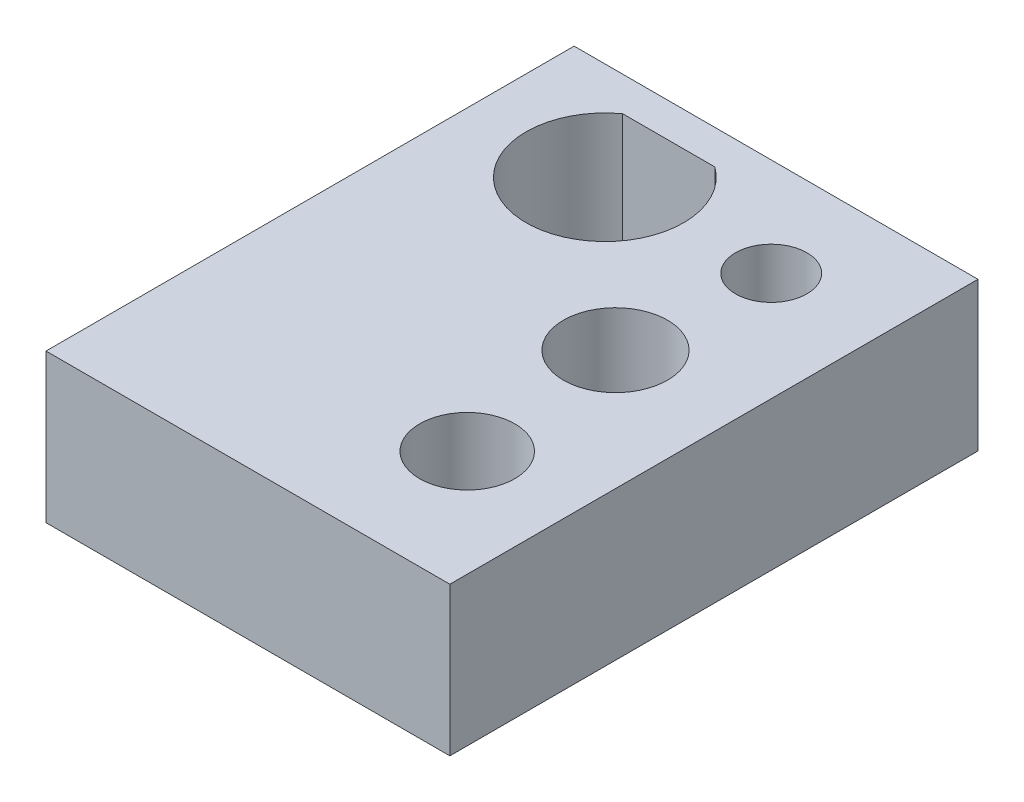
ISO-10303-21;
HEADER;
FILE_DESCRIPTION(('STEP AP214'),'2;1');
FILE_NAME('part.step','',(''),(''),'','','');
FILE_SCHEMA(('AUTOMOTIVE_DESIGN { 1 0 10303 214 1 1 1 1 }'));
ENDSEC;
DATA;
#1=APPLICATION_CONTEXT('core data for automotive mechanical design processes');
#2=APPLICATION_PROTOCOL_DEFINITION('international standard','automotive_design',2000,#1);
#3=PRODUCT_CONTEXT('',#1,'mechanical');
#4=PRODUCT('Part','Part','',(#3));
#5=PRODUCT_RELATED_PRODUCT_CATEGORY('part','',(#4));
#6=PRODUCT_DEFINITION_FORMATION('','',#4);
#7=PRODUCT_DEFINITION_CONTEXT('part definition',#1,'design');
#8=PRODUCT_DEFINITION('design','',#6,#7);
#9=PRODUCT_DEFINITION_SHAPE('','',#8);
#10=(LENGTH_UNIT() NAMED_UNIT(*) SI_UNIT(.MILLI.,.METRE.));
#11=(NAMED_UNIT(*) PLANE_ANGLE_UNIT() SI_UNIT($,.RADIAN.));
#12=(NAMED_UNIT(*) SI_UNIT($,.STERADIAN.) SOLID_ANGLE_UNIT());
#13=UNCERTAINTY_MEASURE_WITH_UNIT(LENGTH_MEASURE(1.E-05),#10,'distance_accuracy_value','');
#14=(GEOMETRIC_REPRESENTATION_CONTEXT(3) GLOBAL_UNCERTAINTY_ASSIGNED_CONTEXT((#13)) GLOBAL_UNIT_ASSIGNED_CONTEXT((#10,
#11,#12)) REPRESENTATION_CONTEXT('',''));
#15=CARTESIAN_POINT('',(0.,0.,0.));
#16=DIRECTION('',(0.,0.,1.));
#17=DIRECTION('',(1.,0.,0.));
#18=AXIS2_PLACEMENT_3D('',#15,#16,#17);
#19=CARTESIAN_POINT('',(0.,5.,0.));
#20=DIRECTION('',(0.,1.,0.));
#21=DIRECTION('',(0.,0.,1.));
#22=AXIS2_PLACEMENT_3D('',#19,#20,#21);
#23=PLANE('',#22);
#24=CARTESIAN_POINT('',(-2.66704706228756,5.,-1.23778604688469));
#25=DIRECTION('',(0.,1.,0.));
#26=DIRECTION('',(0.,0.,1.));
#27=AXIS2_PLACEMENT_3D('',#24,#25,#26);
#28=CIRCLE('',#27,1.2);
#29=CARTESIAN_POINT('',(-2.66704706228756,5.,-0.0377860468846888));
#30=VERTEX_POINT('',#29);
#31=EDGE_CURVE('E211',#30,#30,#28,.T.);
#32=ORIENTED_EDGE('',*,*,#31,.F.);
#33=EDGE_LOOP('',(#32));
#34=FACE_BOUND('',#33,.T.);
#35=DIRECTION('',(-1.,0.,0.));
#36=VECTOR('',#35,1.);
#37=CARTESIAN_POINT('',(-9.81090987129564,5.,-3.38778604688469));
#38=LINE('',#37,#36);
#39=CARTESIAN_POINT('',(-6.71252319432971,5.,-3.38778604688469));
#40=VERTEX_POINT('',#39);
#41=CARTESIAN_POINT('',(-9.81090987129564,5.,-3.38778604688469));
#42=VERTEX_POINT('',#41);
#43=EDGE_CURVE('E93',#40,#42,#38,.T.);
#44=ORIENTED_EDGE('',*,*,#43,.F.);
#45=CARTESIAN_POINT('',(-8.26171653281267,5.,-1.23778604688469));
#46=DIRECTION('',(0.,1.,0.));
#47=DIRECTION('',(0.,0.,1.));
#48=AXIS2_PLACEMENT_3D('',#45,#46,#47);
#49=CIRCLE('',#48,2.65);
#50=EDGE_CURVE('E99',#42,#40,#49,.T.);
#51=ORIENTED_EDGE('',*,*,#50,.F.);
#52=EDGE_LOOP('',(#44,#51));
#53=FACE_BOUND('',#52,.T.);
#54=DIRECTION('',(0.,0.,1.));
#55=VECTOR('',#54,1.);
#56=CARTESIAN_POINT('',(-12.5977729596847,5.,-4.54054716192483));
#57=LINE('',#56,#55);
#58=CARTESIAN_POINT('',(-12.5977729596847,5.,-4.54054716192483));
#59=VERTEX_POINT('',#58);
#60=CARTESIAN_POINT('',(-12.5977729596847,5.,13.220461971685));
#61=VERTEX_POINT('',#60);
#62=EDGE_CURVE('E115',#59,#61,#57,.T.);
#63=ORIENTED_EDGE('',*,*,#62,.T.);
#64=DIRECTION('',(1.,0.,0.));
#65=VECTOR('',#64,1.);
#66=CARTESIAN_POINT('',(-12.5977729596847,5.,13.220461971685));
#67=LINE('',#66,#65);
#68=CARTESIAN_POINT('',(0.984175201311116,5.,13.220461971685));
#69=VERTEX_POINT('',#68);
#70=EDGE_CURVE('E118',#61,#69,#67,.T.);
#71=ORIENTED_EDGE('',*,*,#70,.T.);
#72=DIRECTION('',(0.,0.,-1.));
#73=VECTOR('',#72,1.);
#74=CARTESIAN_POINT('',(0.984175201311114,5.,-4.54054716192483));
#75=LINE('',#74,#73);
#76=CARTESIAN_POINT('',(0.984175201311114,5.,-4.54054716192483));
#77=VERTEX_POINT('',#76);
#78=EDGE_CURVE('E121',#69,#77,#75,.T.);
#79=ORIENTED_EDGE('',*,*,#78,.T.);
#80=DIRECTION('',(-1.,0.,0.));
#81=VECTOR('',#80,1.);
#82=CARTESIAN_POINT('',(-12.5977729596847,5.,-4.54054716192483));
#83=LINE('',#82,#81);
#84=EDGE_CURVE('E123',#77,#59,#83,.T.);
#85=ORIENTED_EDGE('',*,*,#84,.T.);
#86=EDGE_LOOP('',(#63,#71,#79,#85));
#87=FACE_BOUND('',#86,.T.);
#88=CARTESIAN_POINT('',(-2.59605636495823,5.,9.056132184409));
#89=DIRECTION('',(0.,1.,0.));
#90=DIRECTION('',(0.,0.,1.));
#91=AXIS2_PLACEMENT_3D('',#88,#89,#90);
#92=CIRCLE('',#91,1.6);
#93=CARTESIAN_POINT('',(-2.59605636495823,5.,10.656132184409));
#94=VERTEX_POINT('',#93);
#95=EDGE_CURVE('E111',#94,#94,#92,.T.);
#96=ORIENTED_EDGE('',*,*,#95,.F.);
#97=EDGE_LOOP('',(#96));
#98=FACE_BOUND('',#97,.T.);
#99=CARTESIAN_POINT('',(-3.0466930249895,5.,3.61962648657831));
#100=DIRECTION('',(0.,1.,0.));
#101=DIRECTION('',(0.,0.,1.));
#102=AXIS2_PLACEMENT_3D('',#99,#100,#101);
#103=CIRCLE('',#102,1.75);
#104=CARTESIAN_POINT('',(-3.0466930249895,5.,5.36962648657831));
#105=VERTEX_POINT('',#104);
#106=EDGE_CURVE('E202',#105,#105,#103,.T.);
#107=ORIENTED_EDGE('',*,*,#106,.F.);
#108=EDGE_LOOP('',(#107));
#109=FACE_BOUND('',#108,.T.);
#110=ADVANCED_FACE('F41',(#34,#53,#87,#98,#109),#23,.T.);
#111=CARTESIAN_POINT('',(0.,0.,0.));
#112=DIRECTION('',(0.,1.,0.));
#113=DIRECTION('',(0.,0.,1.));
#114=AXIS2_PLACEMENT_3D('',#111,#112,#113);
#115=PLANE('',#114);
#116=DIRECTION('',(0.,0.,1.));
#117=VECTOR('',#116,1.);
#118=CARTESIAN_POINT('',(-12.5977729596847,0.,-4.54054716192483));
#119=LINE('',#118,#117);
#120=CARTESIAN_POINT('',(-12.5977729596847,0.,-4.54054716192483));
#121=VERTEX_POINT('',#120);
#122=CARTESIAN_POINT('',(-12.5977729596847,0.,13.220461971685));
#123=VERTEX_POINT('',#122);
#124=EDGE_CURVE('E114',#121,#123,#119,.T.);
#125=ORIENTED_EDGE('',*,*,#124,.F.);
#126=DIRECTION('',(-1.,0.,0.));
#127=VECTOR('',#126,1.);
#128=CARTESIAN_POINT('',(-12.5977729596847,0.,-4.54054716192483));
#129=LINE('',#128,#127);
#130=CARTESIAN_POINT('',(0.984175201311114,0.,-4.54054716192483));
#131=VERTEX_POINT('',#130);
#132=EDGE_CURVE('E119',#131,#121,#129,.T.);
#133=ORIENTED_EDGE('',*,*,#132,.F.);
#134=DIRECTION('',(0.,0.,-1.));
#135=VECTOR('',#134,1.);
#136=CARTESIAN_POINT('',(0.984175201311114,0.,-4.54054716192483));
#137=LINE('',#136,#135);
#138=CARTESIAN_POINT('',(0.984175201311116,0.,13.220461971685));
#139=VERTEX_POINT('',#138);
#140=EDGE_CURVE('E130',#139,#131,#137,.T.);
#141=ORIENTED_EDGE('',*,*,#140,.F.);
#142=DIRECTION('',(1.,0.,0.));
#143=VECTOR('',#142,1.);
#144=CARTESIAN_POINT('',(-12.5977729596847,0.,13.220461971685));
#145=LINE('',#144,#143);
#146=EDGE_CURVE('E128',#123,#139,#145,.T.);
#147=ORIENTED_EDGE('',*,*,#146,.F.);
#148=EDGE_LOOP('',(#125,#133,#141,#147));
#149=FACE_BOUND('',#148,.T.);
#150=CARTESIAN_POINT('',(-8.26171653281267,0.,-1.23778604688469));
#151=DIRECTION('',(0.,1.,0.));
#152=DIRECTION('',(0.,0.,1.));
#153=AXIS2_PLACEMENT_3D('',#150,#151,#152);
#154=CIRCLE('',#153,2.65);
#155=CARTESIAN_POINT('',(-9.81090987129564,0.,-3.38778604688469));
#156=VERTEX_POINT('',#155);
#157=CARTESIAN_POINT('',(-6.71252319432971,0.,-3.38778604688469));
#158=VERTEX_POINT('',#157);
#159=EDGE_CURVE('E63',#156,#158,#154,.T.);
#160=ORIENTED_EDGE('',*,*,#159,.T.);
#161=DIRECTION('',(-1.,0.,0.));
#162=VECTOR('',#161,1.);
#163=CARTESIAN_POINT('',(-9.81090987129564,0.,-3.38778604688469));
#164=LINE('',#163,#162);
#165=EDGE_CURVE('E104',#158,#156,#164,.T.);
#166=ORIENTED_EDGE('',*,*,#165,.T.);
#167=EDGE_LOOP('',(#160,#166));
#168=FACE_BOUND('',#167,.T.);
#169=CARTESIAN_POINT('',(-2.59605636495823,0.,9.056132184409));
#170=DIRECTION('',(0.,1.,0.));
#171=DIRECTION('',(0.,0.,1.));
#172=AXIS2_PLACEMENT_3D('',#169,#170,#171);
#173=CIRCLE('',#172,1.6);
#174=CARTESIAN_POINT('',(-2.59605636495823,0.,10.656132184409));
#175=VERTEX_POINT('',#174);
#176=EDGE_CURVE('E108',#175,#175,#173,.T.);
#177=ORIENTED_EDGE('',*,*,#176,.T.);
#178=EDGE_LOOP('',(#177));
#179=FACE_BOUND('',#178,.T.);
#180=CARTESIAN_POINT('',(-2.66704706228756,0.,-1.23778604688469));
#181=DIRECTION('',(0.,1.,0.));
#182=DIRECTION('',(0.,0.,1.));
#183=AXIS2_PLACEMENT_3D('',#180,#181,#182);
#184=CIRCLE('',#183,1.2);
#185=CARTESIAN_POINT('',(-2.66704706228756,0.,-0.0377860468846888));
#186=VERTEX_POINT('',#185);
#187=EDGE_CURVE('E208',#186,#186,#184,.T.);
#188=ORIENTED_EDGE('',*,*,#187,.T.);
#189=EDGE_LOOP('',(#188));
#190=FACE_BOUND('',#189,.T.);
#191=CARTESIAN_POINT('',(-3.0466930249895,0.,3.61962648657831));
#192=DIRECTION('',(0.,1.,0.));
#193=DIRECTION('',(0.,0.,1.));
#194=AXIS2_PLACEMENT_3D('',#191,#192,#193);
#195=CIRCLE('',#194,1.75);
#196=CARTESIAN_POINT('',(-3.0466930249895,0.,5.36962648657831));
#197=VERTEX_POINT('',#196);
#198=EDGE_CURVE('E205',#197,#197,#195,.T.);
#199=ORIENTED_EDGE('',*,*,#198,.T.);
#200=EDGE_LOOP('',(#199));
#201=FACE_BOUND('',#200,.T.);
#202=ADVANCED_FACE('F148',(#149,#168,#179,#190,#201),#115,.F.);
#203=CARTESIAN_POINT('',(-12.5977729596847,5.,-4.54054716192483));
#204=DIRECTION('',(1.,0.,0.));
#205=DIRECTION('',(0.,0.,-1.));
#206=AXIS2_PLACEMENT_3D('',#203,#204,#205);
#207=PLANE('',#206);
#208=ORIENTED_EDGE('',*,*,#124,.T.);
#209=DIRECTION('',(0.,-1.,0.));
#210=VECTOR('',#209,1.);
#211=CARTESIAN_POINT('',(-12.5977729596847,5.,13.220461971685));
#212=LINE('',#211,#210);
#213=EDGE_CURVE('E11',#61,#123,#212,.T.);
#214=ORIENTED_EDGE('',*,*,#213,.F.);
#215=ORIENTED_EDGE('',*,*,#62,.F.);
#216=DIRECTION('',(0.,-1.,0.));
#217=VECTOR('',#216,1.);
#218=CARTESIAN_POINT('',(-12.5977729596847,5.,-4.54054716192483));
#219=LINE('',#218,#217);
#220=EDGE_CURVE('E125',#59,#121,#219,.T.);
#221=ORIENTED_EDGE('',*,*,#220,.T.);
#222=EDGE_LOOP('',(#208,#214,#215,#221));
#223=FACE_BOUND('',#222,.T.);
#224=ADVANCED_FACE('F43',(#223),#207,.F.);
#225=CARTESIAN_POINT('',(-12.5977729596847,5.,13.220461971685));
#226=DIRECTION('',(0.,0.,-1.));
#227=DIRECTION('',(-1.,0.,0.));
#228=AXIS2_PLACEMENT_3D('',#225,#226,#227);
#229=PLANE('',#228);
#230=ORIENTED_EDGE('',*,*,#146,.T.);
#231=DIRECTION('',(0.,-1.,0.));
#232=VECTOR('',#231,1.);
#233=CARTESIAN_POINT('',(0.984175201311116,5.,13.220461971685));
#234=LINE('',#233,#232);
#235=EDGE_CURVE('E49',#69,#139,#234,.T.);
#236=ORIENTED_EDGE('',*,*,#235,.F.);
#237=ORIENTED_EDGE('',*,*,#70,.F.);
#238=ORIENTED_EDGE('',*,*,#213,.T.);
#239=EDGE_LOOP('',(#230,#236,#237,#238));
#240=FACE_BOUND('',#239,.T.);
#241=ADVANCED_FACE('F158',(#240),#229,.F.);
#242=CARTESIAN_POINT('',(0.984175201311114,5.,-4.54054716192483));
#243=DIRECTION('',(-1.,0.,0.));
#244=DIRECTION('',(0.,0.,1.));
#245=AXIS2_PLACEMENT_3D('',#242,#243,#244);
#246=PLANE('',#245);
#247=ORIENTED_EDGE('',*,*,#140,.T.);
#248=DIRECTION('',(0.,-1.,0.));
#249=VECTOR('',#248,1.);
#250=CARTESIAN_POINT('',(0.984175201311114,5.,-4.54054716192483));
#251=LINE('',#250,#249);
#252=EDGE_CURVE('E135',#77,#131,#251,.T.);
#253=ORIENTED_EDGE('',*,*,#252,.F.);
#254=ORIENTED_EDGE('',*,*,#78,.F.);
#255=ORIENTED_EDGE('',*,*,#235,.T.);
#256=EDGE_LOOP('',(#247,#253,#254,#255));
#257=FACE_BOUND('',#256,.T.);
#258=ADVANCED_FACE('F142',(#257),#246,.F.);
#259=CARTESIAN_POINT('',(-12.5977729596847,5.,-4.54054716192483));
#260=DIRECTION('',(0.,0.,1.));
#261=DIRECTION('',(1.,0.,0.));
#262=AXIS2_PLACEMENT_3D('',#259,#260,#261);
#263=PLANE('',#262);
#264=ORIENTED_EDGE('',*,*,#132,.T.);
#265=ORIENTED_EDGE('',*,*,#220,.F.);
#266=ORIENTED_EDGE('',*,*,#84,.F.);
#267=ORIENTED_EDGE('',*,*,#252,.T.);
#268=EDGE_LOOP('',(#264,#265,#266,#267));
#269=FACE_BOUND('',#268,.T.);
#270=ADVANCED_FACE('F152',(#269),#263,.F.);
#271=CARTESIAN_POINT('',(-8.26171653281267,5.,-1.23778604688469));
#272=DIRECTION('',(0.,-1.,0.));
#273=DIRECTION('',(0.,0.,-1.));
#274=AXIS2_PLACEMENT_3D('',#271,#272,#273);
#275=CYLINDRICAL_SURFACE('',#274,2.65);
#276=ORIENTED_EDGE('',*,*,#159,.F.);
#277=DIRECTION('',(0.,-1.,0.));
#278=VECTOR('',#277,1.);
#279=CARTESIAN_POINT('',(-9.81090987129564,5.,-3.38778604688469));
#280=LINE('',#279,#278);
#281=EDGE_CURVE('E95',#42,#156,#280,.T.);
#282=ORIENTED_EDGE('',*,*,#281,.F.);
#283=ORIENTED_EDGE('',*,*,#50,.T.);
#284=DIRECTION('',(0.,-1.,0.));
#285=VECTOR('',#284,1.);
#286=CARTESIAN_POINT('',(-6.71252319432971,5.,-3.38778604688469));
#287=LINE('',#286,#285);
#288=EDGE_CURVE('E56',#40,#158,#287,.T.);
#289=ORIENTED_EDGE('',*,*,#288,.T.);
#290=EDGE_LOOP('',(#276,#282,#283,#289));
#291=FACE_BOUND('',#290,.T.);
#292=ADVANCED_FACE('F101',(#291),#275,.F.);
#293=CARTESIAN_POINT('',(-9.81090987129564,5.,-3.38778604688469));
#294=DIRECTION('',(0.,0.,1.));
#295=DIRECTION('',(1.,0.,0.));
#296=AXIS2_PLACEMENT_3D('',#293,#294,#295);
#297=PLANE('',#296);
#298=ORIENTED_EDGE('',*,*,#165,.F.);
#299=ORIENTED_EDGE('',*,*,#288,.F.);
#300=ORIENTED_EDGE('',*,*,#43,.T.);
#301=ORIENTED_EDGE('',*,*,#281,.T.);
#302=EDGE_LOOP('',(#298,#299,#300,#301));
#303=FACE_BOUND('',#302,.T.);
#304=ADVANCED_FACE('F94',(#303),#297,.T.);
#305=CARTESIAN_POINT('',(-2.59605636495823,5.,9.056132184409));
#306=DIRECTION('',(0.,-1.,0.));
#307=DIRECTION('',(0.,0.,-1.));
#308=AXIS2_PLACEMENT_3D('',#305,#306,#307);
#309=CYLINDRICAL_SURFACE('',#308,1.6);
#310=ORIENTED_EDGE('',*,*,#95,.T.);
#311=EDGE_LOOP('',(#310));
#312=FACE_BOUND('',#311,.T.);
#313=ORIENTED_EDGE('',*,*,#176,.F.);
#314=EDGE_LOOP('',(#313));
#315=FACE_BOUND('',#314,.T.);
#316=ADVANCED_FACE('F183',(#312,#315),#309,.F.);
#317=CARTESIAN_POINT('',(-2.66704706228756,5.,-1.23778604688469));
#318=DIRECTION('',(0.,-1.,0.));
#319=DIRECTION('',(0.,0.,-1.));
#320=AXIS2_PLACEMENT_3D('',#317,#318,#319);
#321=CYLINDRICAL_SURFACE('',#320,1.2);
#322=ORIENTED_EDGE('',*,*,#31,.T.);
#323=EDGE_LOOP('',(#322));
#324=FACE_BOUND('',#323,.T.);
#325=ORIENTED_EDGE('',*,*,#187,.F.);
#326=EDGE_LOOP('',(#325));
#327=FACE_BOUND('',#326,.T.);
#328=ADVANCED_FACE('F187',(#324,#327),#321,.F.);
#329=CARTESIAN_POINT('',(-3.0466930249895,5.,3.61962648657831));
#330=DIRECTION('',(0.,-1.,0.));
#331=DIRECTION('',(0.,0.,-1.));
#332=AXIS2_PLACEMENT_3D('',#329,#330,#331);
#333=CYLINDRICAL_SURFACE('',#332,1.75);
#334=ORIENTED_EDGE('',*,*,#106,.T.);
#335=EDGE_LOOP('',(#334));
#336=FACE_BOUND('',#335,.T.);
#337=ORIENTED_EDGE('',*,*,#198,.F.);
#338=EDGE_LOOP('',(#337));
#339=FACE_BOUND('',#338,.T.);
#340=ADVANCED_FACE('F193',(#336,#339),#333,.F.);
#341=CLOSED_SHELL('',(#110,#202,#224,#241,#258,#270,#292,#304,#316,#328,#340));
#342=MANIFOLD_SOLID_BREP('B2',#341);
#343=ADVANCED_BREP_SHAPE_REPRESENTATION('',(#18,#342),#14);
#344=SHAPE_DEFINITION_REPRESENTATION(#9,#343);
ENDSEC;
END-ISO-10303-21;
